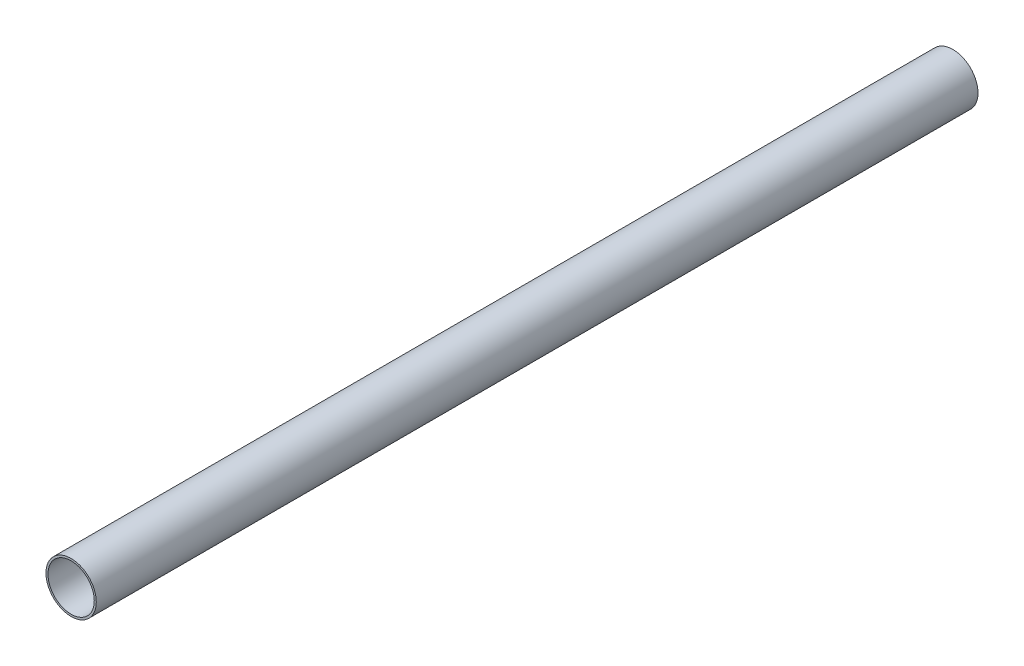
ISO-10303-21;
HEADER;
FILE_DESCRIPTION(('STEP AP214'),'2;1');
FILE_NAME('part.step','',(''),(''),'','','');
FILE_SCHEMA(('AUTOMOTIVE_DESIGN { 1 0 10303 214 1 1 1 1 }'));
ENDSEC;
DATA;
#1=APPLICATION_CONTEXT('core data for automotive mechanical design processes');
#2=APPLICATION_PROTOCOL_DEFINITION('international standard','automotive_design',2000,#1);
#3=PRODUCT_CONTEXT('',#1,'mechanical');
#4=PRODUCT('Part','Part','',(#3));
#5=PRODUCT_RELATED_PRODUCT_CATEGORY('part','',(#4));
#6=PRODUCT_DEFINITION_FORMATION('','',#4);
#7=PRODUCT_DEFINITION_CONTEXT('part definition',#1,'design');
#8=PRODUCT_DEFINITION('design','',#6,#7);
#9=PRODUCT_DEFINITION_SHAPE('','',#8);
#10=(LENGTH_UNIT() NAMED_UNIT(*) SI_UNIT(.MILLI.,.METRE.));
#11=(NAMED_UNIT(*) PLANE_ANGLE_UNIT() SI_UNIT($,.RADIAN.));
#12=(NAMED_UNIT(*) SI_UNIT($,.STERADIAN.) SOLID_ANGLE_UNIT());
#13=UNCERTAINTY_MEASURE_WITH_UNIT(LENGTH_MEASURE(1.E-05),#10,'distance_accuracy_value','');
#14=(GEOMETRIC_REPRESENTATION_CONTEXT(3) GLOBAL_UNCERTAINTY_ASSIGNED_CONTEXT((#13)) GLOBAL_UNIT_ASSIGNED_CONTEXT((#10,
#11,#12)) REPRESENTATION_CONTEXT('',''));
#15=CARTESIAN_POINT('',(0.,0.,0.));
#16=DIRECTION('',(0.,0.,1.));
#17=DIRECTION('',(1.,0.,0.));
#18=AXIS2_PLACEMENT_3D('',#15,#16,#17);
#19=CARTESIAN_POINT('',(0.,0.,219.));
#20=DIRECTION('',(0.,0.,1.));
#21=DIRECTION('',(1.,0.,0.));
#22=AXIS2_PLACEMENT_3D('',#19,#20,#21);
#23=PLANE('',#22);
#24=CARTESIAN_POINT('',(0.,0.,219.));
#25=DIRECTION('',(0.,0.,1.));
#26=DIRECTION('',(1.,0.,0.));
#27=AXIS2_PLACEMENT_3D('',#24,#25,#26);
#28=CIRCLE('',#27,12.5);
#29=CARTESIAN_POINT('',(12.5,0.,219.));
#30=VERTEX_POINT('',#29);
#31=EDGE_CURVE('E10',#30,#30,#28,.T.);
#32=ORIENTED_EDGE('',*,*,#31,.T.);
#33=EDGE_LOOP('',(#32));
#34=FACE_BOUND('',#33,.T.);
#35=CARTESIAN_POINT('',(0.,0.,219.));
#36=DIRECTION('',(0.,0.,1.));
#37=DIRECTION('',(1.,0.,0.));
#38=AXIS2_PLACEMENT_3D('',#35,#36,#37);
#39=CIRCLE('',#38,11.5);
#40=CARTESIAN_POINT('',(11.5,0.,219.));
#41=VERTEX_POINT('',#40);
#42=EDGE_CURVE('E44',#41,#41,#39,.T.);
#43=ORIENTED_EDGE('',*,*,#42,.F.);
#44=EDGE_LOOP('',(#43));
#45=FACE_BOUND('',#44,.T.);
#46=ADVANCED_FACE('F33',(#34,#45),#23,.T.);
#47=CARTESIAN_POINT('',(0.,0.,-219.));
#48=DIRECTION('',(0.,0.,1.));
#49=DIRECTION('',(1.,0.,0.));
#50=AXIS2_PLACEMENT_3D('',#47,#48,#49);
#51=PLANE('',#50);
#52=CARTESIAN_POINT('',(0.,0.,-219.));
#53=DIRECTION('',(0.,0.,1.));
#54=DIRECTION('',(1.,0.,0.));
#55=AXIS2_PLACEMENT_3D('',#52,#53,#54);
#56=CIRCLE('',#55,12.5);
#57=CARTESIAN_POINT('',(12.5,0.,-219.));
#58=VERTEX_POINT('',#57);
#59=EDGE_CURVE('E37',#58,#58,#56,.T.);
#60=ORIENTED_EDGE('',*,*,#59,.F.);
#61=EDGE_LOOP('',(#60));
#62=FACE_BOUND('',#61,.T.);
#63=CARTESIAN_POINT('',(0.,0.,-219.));
#64=DIRECTION('',(0.,0.,1.));
#65=DIRECTION('',(1.,0.,0.));
#66=AXIS2_PLACEMENT_3D('',#63,#64,#65);
#67=CIRCLE('',#66,11.5);
#68=CARTESIAN_POINT('',(11.5,0.,-219.));
#69=VERTEX_POINT('',#68);
#70=EDGE_CURVE('E46',#69,#69,#67,.T.);
#71=ORIENTED_EDGE('',*,*,#70,.T.);
#72=EDGE_LOOP('',(#71));
#73=FACE_BOUND('',#72,.T.);
#74=ADVANCED_FACE('F56',(#62,#73),#51,.F.);
#75=CARTESIAN_POINT('',(0.,0.,219.));
#76=DIRECTION('',(0.,0.,-1.));
#77=DIRECTION('',(-1.,0.,0.));
#78=AXIS2_PLACEMENT_3D('',#75,#76,#77);
#79=CYLINDRICAL_SURFACE('',#78,12.5);
#80=ORIENTED_EDGE('',*,*,#31,.F.);
#81=EDGE_LOOP('',(#80));
#82=FACE_BOUND('',#81,.T.);
#83=ORIENTED_EDGE('',*,*,#59,.T.);
#84=EDGE_LOOP('',(#83));
#85=FACE_BOUND('',#84,.T.);
#86=ADVANCED_FACE('F35',(#82,#85),#79,.T.);
#87=CARTESIAN_POINT('',(0.,0.,219.));
#88=DIRECTION('',(0.,0.,-1.));
#89=DIRECTION('',(-1.,0.,0.));
#90=AXIS2_PLACEMENT_3D('',#87,#88,#89);
#91=CYLINDRICAL_SURFACE('',#90,11.5);
#92=ORIENTED_EDGE('',*,*,#42,.T.);
#93=EDGE_LOOP('',(#92));
#94=FACE_BOUND('',#93,.T.);
#95=ORIENTED_EDGE('',*,*,#70,.F.);
#96=EDGE_LOOP('',(#95));
#97=FACE_BOUND('',#96,.T.);
#98=ADVANCED_FACE('F52',(#94,#97),#91,.F.);
#99=CLOSED_SHELL('',(#46,#74,#86,#98));
#100=MANIFOLD_SOLID_BREP('B2',#99);
#101=ADVANCED_BREP_SHAPE_REPRESENTATION('',(#18,#100),#14);
#102=SHAPE_DEFINITION_REPRESENTATION(#9,#101);
ENDSEC;
END-ISO-10303-21;
